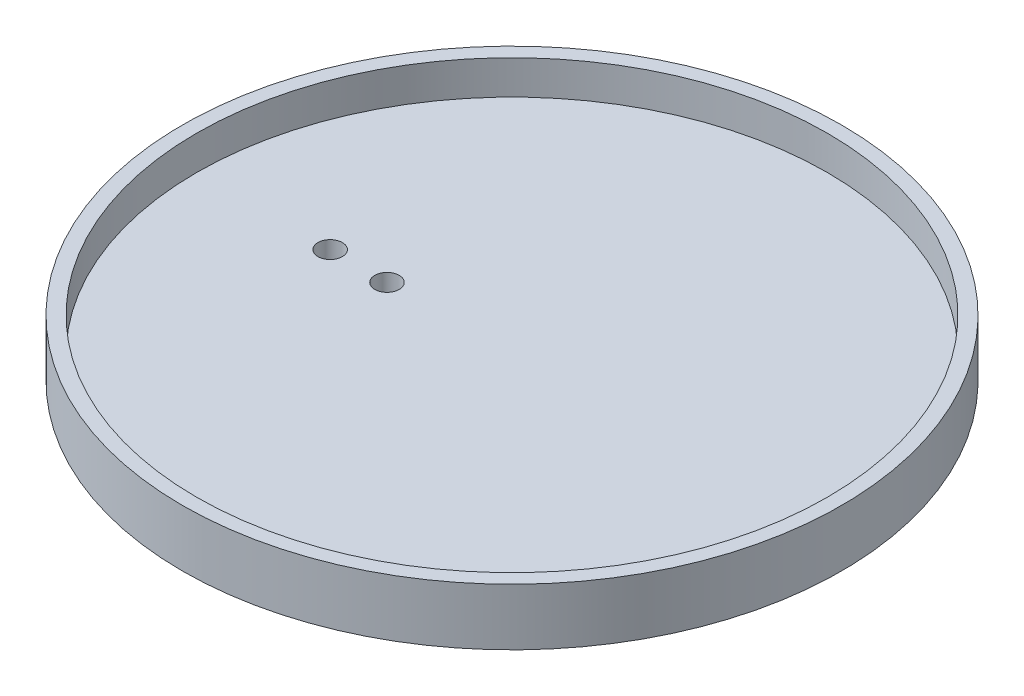
ISO-10303-21;
HEADER;
FILE_DESCRIPTION(('STEP AP214'),'2;1');
FILE_NAME('part.step','',(''),(''),'','','');
FILE_SCHEMA(('AUTOMOTIVE_DESIGN { 1 0 10303 214 1 1 1 1 }'));
ENDSEC;
DATA;
#1=APPLICATION_CONTEXT('core data for automotive mechanical design processes');
#2=APPLICATION_PROTOCOL_DEFINITION('international standard','automotive_design',2000,#1);
#3=PRODUCT_CONTEXT('',#1,'mechanical');
#4=PRODUCT('Part','Part','',(#3));
#5=PRODUCT_RELATED_PRODUCT_CATEGORY('part','',(#4));
#6=PRODUCT_DEFINITION_FORMATION('','',#4);
#7=PRODUCT_DEFINITION_CONTEXT('part definition',#1,'design');
#8=PRODUCT_DEFINITION('design','',#6,#7);
#9=PRODUCT_DEFINITION_SHAPE('','',#8);
#10=(LENGTH_UNIT() NAMED_UNIT(*) SI_UNIT(.MILLI.,.METRE.));
#11=(NAMED_UNIT(*) PLANE_ANGLE_UNIT() SI_UNIT($,.RADIAN.));
#12=(NAMED_UNIT(*) SI_UNIT($,.STERADIAN.) SOLID_ANGLE_UNIT());
#13=UNCERTAINTY_MEASURE_WITH_UNIT(LENGTH_MEASURE(1.E-05),#10,'distance_accuracy_value','');
#14=(GEOMETRIC_REPRESENTATION_CONTEXT(3) GLOBAL_UNCERTAINTY_ASSIGNED_CONTEXT((#13)) GLOBAL_UNIT_ASSIGNED_CONTEXT((#10,
#11,#12)) REPRESENTATION_CONTEXT('',''));
#15=CARTESIAN_POINT('',(0.,0.,0.));
#16=DIRECTION('',(0.,0.,1.));
#17=DIRECTION('',(1.,0.,0.));
#18=AXIS2_PLACEMENT_3D('',#15,#16,#17);
#19=CARTESIAN_POINT('',(0.,4.,0.));
#20=DIRECTION('',(0.,-1.,0.));
#21=DIRECTION('',(0.,0.,-1.));
#22=AXIS2_PLACEMENT_3D('',#19,#20,#21);
#23=CYLINDRICAL_SURFACE('',#22,58.);
#24=CARTESIAN_POINT('',(0.,0.,0.));
#25=DIRECTION('',(0.,1.,0.));
#26=DIRECTION('',(0.,0.,1.));
#27=AXIS2_PLACEMENT_3D('',#24,#25,#26);
#28=CIRCLE('',#27,58.);
#29=CARTESIAN_POINT('',(0.,0.,58.));
#30=VERTEX_POINT('',#29);
#31=EDGE_CURVE('E40',#30,#30,#28,.T.);
#32=ORIENTED_EDGE('',*,*,#31,.T.);
#33=EDGE_LOOP('',(#32));
#34=FACE_BOUND('',#33,.T.);
#35=CARTESIAN_POINT('',(0.,10.,0.));
#36=DIRECTION('',(0.,1.,0.));
#37=DIRECTION('',(0.,0.,1.));
#38=AXIS2_PLACEMENT_3D('',#35,#36,#37);
#39=CIRCLE('',#38,58.);
#40=CARTESIAN_POINT('',(0.,10.,58.));
#41=VERTEX_POINT('',#40);
#42=EDGE_CURVE('E47',#41,#41,#39,.T.);
#43=ORIENTED_EDGE('',*,*,#42,.F.);
#44=EDGE_LOOP('',(#43));
#45=FACE_BOUND('',#44,.T.);
#46=ADVANCED_FACE('F37',(#34,#45),#23,.T.);
#47=CARTESIAN_POINT('',(0.,0.,0.));
#48=DIRECTION('',(0.,1.,0.));
#49=DIRECTION('',(0.,0.,1.));
#50=AXIS2_PLACEMENT_3D('',#47,#48,#49);
#51=PLANE('',#50);
#52=CARTESIAN_POINT('',(-22.,0.,0.));
#53=DIRECTION('',(0.,1.,0.));
#54=DIRECTION('',(0.,0.,1.));
#55=AXIS2_PLACEMENT_3D('',#52,#53,#54);
#56=CIRCLE('',#55,2.15);
#57=CARTESIAN_POINT('',(-22.,0.,2.15));
#58=VERTEX_POINT('',#57);
#59=EDGE_CURVE('E61',#58,#58,#56,.T.);
#60=ORIENTED_EDGE('',*,*,#59,.T.);
#61=EDGE_LOOP('',(#60));
#62=FACE_BOUND('',#61,.T.);
#63=CARTESIAN_POINT('',(-32.,0.,0.));
#64=DIRECTION('',(0.,1.,0.));
#65=DIRECTION('',(0.,0.,1.));
#66=AXIS2_PLACEMENT_3D('',#63,#64,#65);
#67=CIRCLE('',#66,2.15);
#68=CARTESIAN_POINT('',(-32.,0.,2.15));
#69=VERTEX_POINT('',#68);
#70=EDGE_CURVE('E58',#69,#69,#67,.T.);
#71=ORIENTED_EDGE('',*,*,#70,.T.);
#72=EDGE_LOOP('',(#71));
#73=FACE_BOUND('',#72,.T.);
#74=ORIENTED_EDGE('',*,*,#31,.F.);
#75=EDGE_LOOP('',(#74));
#76=FACE_BOUND('',#75,.T.);
#77=ADVANCED_FACE('F84',(#62,#73,#76),#51,.F.);
#78=CARTESIAN_POINT('',(0.,10.,0.));
#79=DIRECTION('',(0.,1.,0.));
#80=DIRECTION('',(0.,0.,1.));
#81=AXIS2_PLACEMENT_3D('',#78,#79,#80);
#82=PLANE('',#81);
#83=ORIENTED_EDGE('',*,*,#42,.T.);
#84=EDGE_LOOP('',(#83));
#85=FACE_BOUND('',#84,.T.);
#86=CARTESIAN_POINT('',(0.,10.,0.));
#87=DIRECTION('',(0.,1.,0.));
#88=DIRECTION('',(0.,0.,1.));
#89=AXIS2_PLACEMENT_3D('',#86,#87,#88);
#90=CIRCLE('',#89,55.5);
#91=CARTESIAN_POINT('',(0.,10.,55.5));
#92=VERTEX_POINT('',#91);
#93=EDGE_CURVE('E51',#92,#92,#90,.T.);
#94=ORIENTED_EDGE('',*,*,#93,.F.);
#95=EDGE_LOOP('',(#94));
#96=FACE_BOUND('',#95,.T.);
#97=ADVANCED_FACE('F87',(#85,#96),#82,.T.);
#98=CARTESIAN_POINT('',(0.,10.,0.));
#99=DIRECTION('',(0.,-1.,0.));
#100=DIRECTION('',(0.,0.,-1.));
#101=AXIS2_PLACEMENT_3D('',#98,#99,#100);
#102=CYLINDRICAL_SURFACE('',#101,55.5);
#103=CARTESIAN_POINT('',(0.,4.,0.));
#104=DIRECTION('',(0.,1.,0.));
#105=DIRECTION('',(0.,0.,1.));
#106=AXIS2_PLACEMENT_3D('',#103,#104,#105);
#107=CIRCLE('',#106,55.5);
#108=CARTESIAN_POINT('',(0.,4.,55.5));
#109=VERTEX_POINT('',#108);
#110=EDGE_CURVE('E10',#109,#109,#107,.F.);
#111=ORIENTED_EDGE('',*,*,#110,.T.);
#112=EDGE_LOOP('',(#111));
#113=FACE_BOUND('',#112,.T.);
#114=ORIENTED_EDGE('',*,*,#93,.T.);
#115=EDGE_LOOP('',(#114));
#116=FACE_BOUND('',#115,.T.);
#117=ADVANCED_FACE('F74',(#113,#116),#102,.F.);
#118=CARTESIAN_POINT('',(0.,4.,0.));
#119=DIRECTION('',(0.,1.,0.));
#120=DIRECTION('',(0.,0.,1.));
#121=AXIS2_PLACEMENT_3D('',#118,#119,#120);
#122=PLANE('',#121);
#123=CARTESIAN_POINT('',(-22.,4.,0.));
#124=DIRECTION('',(0.,1.,0.));
#125=DIRECTION('',(0.,0.,1.));
#126=AXIS2_PLACEMENT_3D('',#123,#124,#125);
#127=CIRCLE('',#126,2.15);
#128=CARTESIAN_POINT('',(-22.,4.,2.15));
#129=VERTEX_POINT('',#128);
#130=EDGE_CURVE('E54',#129,#129,#127,.T.);
#131=ORIENTED_EDGE('',*,*,#130,.F.);
#132=EDGE_LOOP('',(#131));
#133=FACE_BOUND('',#132,.T.);
#134=CARTESIAN_POINT('',(-32.,4.,0.));
#135=DIRECTION('',(0.,1.,0.));
#136=DIRECTION('',(0.,0.,1.));
#137=AXIS2_PLACEMENT_3D('',#134,#135,#136);
#138=CIRCLE('',#137,2.15);
#139=CARTESIAN_POINT('',(-32.,4.,2.15));
#140=VERTEX_POINT('',#139);
#141=EDGE_CURVE('E55',#140,#140,#138,.T.);
#142=ORIENTED_EDGE('',*,*,#141,.F.);
#143=EDGE_LOOP('',(#142));
#144=FACE_BOUND('',#143,.T.);
#145=ORIENTED_EDGE('',*,*,#110,.F.);
#146=EDGE_LOOP('',(#145));
#147=FACE_BOUND('',#146,.T.);
#148=ADVANCED_FACE('F70',(#133,#144,#147),#122,.T.);
#149=CARTESIAN_POINT('',(-32.,4.,0.));
#150=DIRECTION('',(0.,-1.,0.));
#151=DIRECTION('',(0.,0.,-1.));
#152=AXIS2_PLACEMENT_3D('',#149,#150,#151);
#153=CYLINDRICAL_SURFACE('',#152,2.15);
#154=ORIENTED_EDGE('',*,*,#141,.T.);
#155=EDGE_LOOP('',(#154));
#156=FACE_BOUND('',#155,.T.);
#157=ORIENTED_EDGE('',*,*,#70,.F.);
#158=EDGE_LOOP('',(#157));
#159=FACE_BOUND('',#158,.T.);
#160=ADVANCED_FACE('F73',(#156,#159),#153,.F.);
#161=CARTESIAN_POINT('',(-22.,4.,0.));
#162=DIRECTION('',(0.,-1.,0.));
#163=DIRECTION('',(0.,0.,-1.));
#164=AXIS2_PLACEMENT_3D('',#161,#162,#163);
#165=CYLINDRICAL_SURFACE('',#164,2.15);
#166=ORIENTED_EDGE('',*,*,#130,.T.);
#167=EDGE_LOOP('',(#166));
#168=FACE_BOUND('',#167,.T.);
#169=ORIENTED_EDGE('',*,*,#59,.F.);
#170=EDGE_LOOP('',(#169));
#171=FACE_BOUND('',#170,.T.);
#172=ADVANCED_FACE('F67',(#168,#171),#165,.F.);
#173=CLOSED_SHELL('',(#46,#77,#97,#117,#148,#160,#172));
#174=MANIFOLD_SOLID_BREP('B2',#173);
#175=ADVANCED_BREP_SHAPE_REPRESENTATION('',(#18,#174),#14);
#176=SHAPE_DEFINITION_REPRESENTATION(#9,#175);
ENDSEC;
END-ISO-10303-21;
